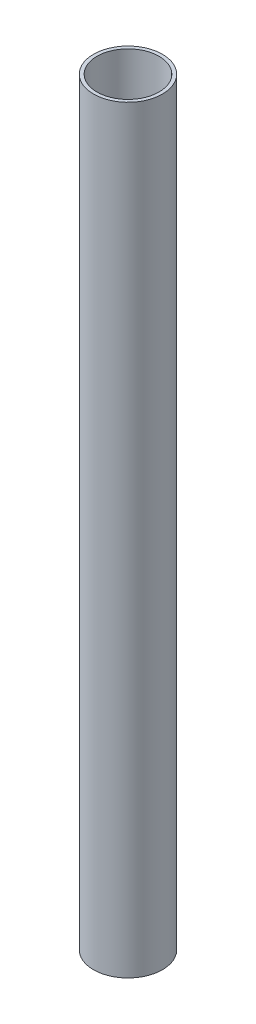
ISO-10303-21;
HEADER;
FILE_DESCRIPTION(('STEP AP214'),'2;1');
FILE_NAME('part.step','',(''),(''),'','','');
FILE_SCHEMA(('AUTOMOTIVE_DESIGN { 1 0 10303 214 1 1 1 1 }'));
ENDSEC;
DATA;
#1=APPLICATION_CONTEXT('core data for automotive mechanical design processes');
#2=APPLICATION_PROTOCOL_DEFINITION('international standard','automotive_design',2000,#1);
#3=PRODUCT_CONTEXT('',#1,'mechanical');
#4=PRODUCT('Part','Part','',(#3));
#5=PRODUCT_RELATED_PRODUCT_CATEGORY('part','',(#4));
#6=PRODUCT_DEFINITION_FORMATION('','',#4);
#7=PRODUCT_DEFINITION_CONTEXT('part definition',#1,'design');
#8=PRODUCT_DEFINITION('design','',#6,#7);
#9=PRODUCT_DEFINITION_SHAPE('','',#8);
#10=(LENGTH_UNIT() NAMED_UNIT(*) SI_UNIT(.MILLI.,.METRE.));
#11=(NAMED_UNIT(*) PLANE_ANGLE_UNIT() SI_UNIT($,.RADIAN.));
#12=(NAMED_UNIT(*) SI_UNIT($,.STERADIAN.) SOLID_ANGLE_UNIT());
#13=UNCERTAINTY_MEASURE_WITH_UNIT(LENGTH_MEASURE(1.E-05),#10,'distance_accuracy_value','');
#14=(GEOMETRIC_REPRESENTATION_CONTEXT(3) GLOBAL_UNCERTAINTY_ASSIGNED_CONTEXT((#13)) GLOBAL_UNIT_ASSIGNED_CONTEXT((#10,
#11,#12)) REPRESENTATION_CONTEXT('',''));
#15=CARTESIAN_POINT('',(0.,0.,0.));
#16=DIRECTION('',(0.,0.,1.));
#17=DIRECTION('',(1.,0.,0.));
#18=AXIS2_PLACEMENT_3D('',#15,#16,#17);
#19=CARTESIAN_POINT('',(0.,110.,0.));
#20=DIRECTION('',(0.,1.,0.));
#21=DIRECTION('',(0.,0.,1.));
#22=AXIS2_PLACEMENT_3D('',#19,#20,#21);
#23=PLANE('',#22);
#24=CARTESIAN_POINT('',(0.,110.,0.));
#25=DIRECTION('',(0.,1.,0.));
#26=DIRECTION('',(0.,0.,1.));
#27=AXIS2_PLACEMENT_3D('',#24,#25,#26);
#28=CIRCLE('',#27,10.);
#29=CARTESIAN_POINT('',(0.,110.,10.));
#30=VERTEX_POINT('',#29);
#31=EDGE_CURVE('E11',#30,#30,#28,.T.);
#32=ORIENTED_EDGE('',*,*,#31,.T.);
#33=EDGE_LOOP('',(#32));
#34=FACE_BOUND('',#33,.T.);
#35=CARTESIAN_POINT('',(0.,110.,0.));
#36=DIRECTION('',(0.,1.,0.));
#37=DIRECTION('',(1.,0.,0.));
#38=AXIS2_PLACEMENT_3D('',#35,#36,#37);
#39=CIRCLE('',#38,9.);
#40=CARTESIAN_POINT('',(9.,110.,0.));
#41=VERTEX_POINT('',#40);
#42=EDGE_CURVE('E50',#41,#41,#39,.T.);
#43=ORIENTED_EDGE('',*,*,#42,.F.);
#44=EDGE_LOOP('',(#43));
#45=FACE_BOUND('',#44,.T.);
#46=ADVANCED_FACE('F39',(#34,#45),#23,.T.);
#47=CARTESIAN_POINT('',(0.,-110.,0.));
#48=DIRECTION('',(0.,1.,0.));
#49=DIRECTION('',(0.,0.,1.));
#50=AXIS2_PLACEMENT_3D('',#47,#48,#49);
#51=PLANE('',#50);
#52=CARTESIAN_POINT('',(0.,-110.,0.));
#53=DIRECTION('',(0.,1.,0.));
#54=DIRECTION('',(0.,0.,1.));
#55=AXIS2_PLACEMENT_3D('',#52,#53,#54);
#56=CIRCLE('',#55,10.);
#57=CARTESIAN_POINT('',(0.,-110.,10.));
#58=VERTEX_POINT('',#57);
#59=EDGE_CURVE('E43',#58,#58,#56,.T.);
#60=ORIENTED_EDGE('',*,*,#59,.F.);
#61=EDGE_LOOP('',(#60));
#62=FACE_BOUND('',#61,.T.);
#63=CARTESIAN_POINT('',(0.,-110.,0.));
#64=DIRECTION('',(0.,1.,0.));
#65=DIRECTION('',(1.,0.,0.));
#66=AXIS2_PLACEMENT_3D('',#63,#64,#65);
#67=CIRCLE('',#66,9.);
#68=CARTESIAN_POINT('',(9.,-110.,0.));
#69=VERTEX_POINT('',#68);
#70=EDGE_CURVE('E52',#69,#69,#67,.T.);
#71=ORIENTED_EDGE('',*,*,#70,.T.);
#72=EDGE_LOOP('',(#71));
#73=FACE_BOUND('',#72,.T.);
#74=ADVANCED_FACE('F62',(#62,#73),#51,.F.);
#75=CARTESIAN_POINT('',(0.,110.,0.));
#76=DIRECTION('',(0.,-1.,0.));
#77=DIRECTION('',(0.,0.,-1.));
#78=AXIS2_PLACEMENT_3D('',#75,#76,#77);
#79=CYLINDRICAL_SURFACE('',#78,10.);
#80=ORIENTED_EDGE('',*,*,#31,.F.);
#81=EDGE_LOOP('',(#80));
#82=FACE_BOUND('',#81,.T.);
#83=ORIENTED_EDGE('',*,*,#59,.T.);
#84=EDGE_LOOP('',(#83));
#85=FACE_BOUND('',#84,.T.);
#86=ADVANCED_FACE('F41',(#82,#85),#79,.T.);
#87=CARTESIAN_POINT('',(0.,110.,0.));
#88=DIRECTION('',(0.,-1.,0.));
#89=DIRECTION('',(0.,0.,-1.));
#90=AXIS2_PLACEMENT_3D('',#87,#88,#89);
#91=CYLINDRICAL_SURFACE('',#90,9.);
#92=ORIENTED_EDGE('',*,*,#42,.T.);
#93=EDGE_LOOP('',(#92));
#94=FACE_BOUND('',#93,.T.);
#95=ORIENTED_EDGE('',*,*,#70,.F.);
#96=EDGE_LOOP('',(#95));
#97=FACE_BOUND('',#96,.T.);
#98=ADVANCED_FACE('F58',(#94,#97),#91,.F.);
#99=CLOSED_SHELL('',(#46,#74,#86,#98));
#100=MANIFOLD_SOLID_BREP('B2',#99);
#101=ADVANCED_BREP_SHAPE_REPRESENTATION('',(#18,#100),#14);
#102=SHAPE_DEFINITION_REPRESENTATION(#9,#101);
ENDSEC;
END-ISO-10303-21;
